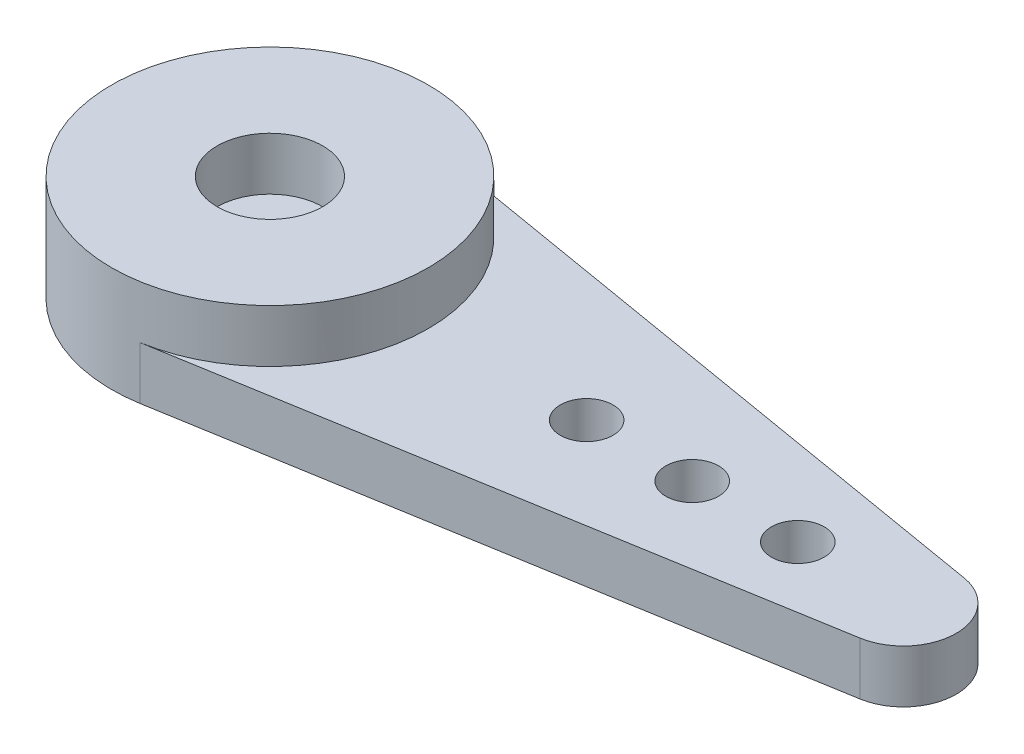
ISO-10303-21;
HEADER;
FILE_DESCRIPTION(('STEP AP214'),'2;1');
FILE_NAME('part.step','',(''),(''),'','','');
FILE_SCHEMA(('AUTOMOTIVE_DESIGN { 1 0 10303 214 1 1 1 1 }'));
ENDSEC;
DATA;
#1=APPLICATION_CONTEXT('core data for automotive mechanical design processes');
#2=APPLICATION_PROTOCOL_DEFINITION('international standard','automotive_design',2000,#1);
#3=PRODUCT_CONTEXT('',#1,'mechanical');
#4=PRODUCT('Part','Part','',(#3));
#5=PRODUCT_RELATED_PRODUCT_CATEGORY('part','',(#4));
#6=PRODUCT_DEFINITION_FORMATION('','',#4);
#7=PRODUCT_DEFINITION_CONTEXT('part definition',#1,'design');
#8=PRODUCT_DEFINITION('design','',#6,#7);
#9=PRODUCT_DEFINITION_SHAPE('','',#8);
#10=(LENGTH_UNIT() NAMED_UNIT(*) SI_UNIT(.MILLI.,.METRE.));
#11=(NAMED_UNIT(*) PLANE_ANGLE_UNIT() SI_UNIT($,.RADIAN.));
#12=(NAMED_UNIT(*) SI_UNIT($,.STERADIAN.) SOLID_ANGLE_UNIT());
#13=UNCERTAINTY_MEASURE_WITH_UNIT(LENGTH_MEASURE(1.E-05),#10,'distance_accuracy_value','');
#14=(GEOMETRIC_REPRESENTATION_CONTEXT(3) GLOBAL_UNCERTAINTY_ASSIGNED_CONTEXT((#13)) GLOBAL_UNIT_ASSIGNED_CONTEXT((#10,
#11,#12)) REPRESENTATION_CONTEXT('',''));
#15=CARTESIAN_POINT('',(0.,0.,0.));
#16=DIRECTION('',(0.,0.,1.));
#17=DIRECTION('',(1.,0.,0.));
#18=AXIS2_PLACEMENT_3D('',#15,#16,#17);
#19=CARTESIAN_POINT('',(0.,5.,0.));
#20=DIRECTION('',(0.,-1.,0.));
#21=DIRECTION('',(0.,0.,-1.));
#22=AXIS2_PLACEMENT_3D('',#19,#20,#21);
#23=CYLINDRICAL_SURFACE('',#22,15.);
#24=CARTESIAN_POINT('',(0.,0.,0.));
#25=DIRECTION('',(0.,1.,0.));
#26=DIRECTION('',(0.,0.,1.));
#27=AXIS2_PLACEMENT_3D('',#24,#25,#26);
#28=CIRCLE('',#27,15.);
#29=CARTESIAN_POINT('',(2.5,0.,-14.790199457749));
#30=VERTEX_POINT('',#29);
#31=CARTESIAN_POINT('',(2.5,0.,14.790199457749));
#32=VERTEX_POINT('',#31);
#33=EDGE_CURVE('E87',#30,#32,#28,.T.);
#34=ORIENTED_EDGE('',*,*,#33,.T.);
#35=DIRECTION('',(0.,-1.,0.));
#36=VECTOR('',#35,1.);
#37=CARTESIAN_POINT('',(2.5,5.,14.790199457749));
#38=LINE('',#37,#36);
#39=CARTESIAN_POINT('',(2.5,5.,14.790199457749));
#40=VERTEX_POINT('',#39);
#41=EDGE_CURVE('E11',#40,#32,#38,.T.);
#42=ORIENTED_EDGE('',*,*,#41,.F.);
#43=CARTESIAN_POINT('',(0.,5.,0.));
#44=DIRECTION('',(0.,1.,0.));
#45=DIRECTION('',(0.,0.,1.));
#46=AXIS2_PLACEMENT_3D('',#43,#44,#45);
#47=CIRCLE('',#46,15.);
#48=CARTESIAN_POINT('',(2.5,5.,-14.790199457749));
#49=VERTEX_POINT('',#48);
#50=EDGE_CURVE('E85',#40,#49,#47,.T.);
#51=ORIENTED_EDGE('',*,*,#50,.T.);
#52=DIRECTION('',(0.,-1.,0.));
#53=VECTOR('',#52,1.);
#54=CARTESIAN_POINT('',(2.5,5.,-14.790199457749));
#55=LINE('',#54,#53);
#56=EDGE_CURVE('E106',#49,#30,#55,.T.);
#57=ORIENTED_EDGE('',*,*,#56,.T.);
#58=EDGE_LOOP('',(#34,#42,#51,#57));
#59=FACE_BOUND('',#58,.T.);
#60=CARTESIAN_POINT('',(0.,10.,0.));
#61=DIRECTION('',(0.,1.,0.));
#62=DIRECTION('',(0.,0.,1.));
#63=AXIS2_PLACEMENT_3D('',#60,#61,#62);
#64=CIRCLE('',#63,15.);
#65=CARTESIAN_POINT('',(0.,10.,15.));
#66=VERTEX_POINT('',#65);
#67=EDGE_CURVE('E94',#66,#66,#64,.T.);
#68=ORIENTED_EDGE('',*,*,#67,.F.);
#69=EDGE_LOOP('',(#68));
#70=FACE_BOUND('',#69,.T.);
#71=ADVANCED_FACE('F34',(#59,#70),#23,.T.);
#72=CARTESIAN_POINT('',(2.5,5.,14.790199457749));
#73=DIRECTION('',(-0.166666666666667,0.,-0.986013297183269));
#74=DIRECTION('',(-0.986013297183269,0.,0.166666666666667));
#75=AXIS2_PLACEMENT_3D('',#72,#73,#74);
#76=PLANE('',#75);
#77=DIRECTION('',(0.986013297183269,0.,-0.166666666666667));
#78=VECTOR('',#77,1.);
#79=CARTESIAN_POINT('',(2.5,0.,14.790199457749));
#80=LINE('',#79,#78);
#81=CARTESIAN_POINT('',(60.8333333333333,0.,4.93006648591634));
#82=VERTEX_POINT('',#81);
#83=EDGE_CURVE('E108',#32,#82,#80,.T.);
#84=ORIENTED_EDGE('',*,*,#83,.T.);
#85=DIRECTION('',(0.,-1.,0.));
#86=VECTOR('',#85,1.);
#87=CARTESIAN_POINT('',(60.8333333333333,5.,4.93006648591634));
#88=LINE('',#87,#86);
#89=CARTESIAN_POINT('',(60.8333333333333,5.,4.93006648591634));
#90=VERTEX_POINT('',#89);
#91=EDGE_CURVE('E42',#90,#82,#88,.T.);
#92=ORIENTED_EDGE('',*,*,#91,.F.);
#93=DIRECTION('',(0.986013297183269,0.,-0.166666666666667));
#94=VECTOR('',#93,1.);
#95=CARTESIAN_POINT('',(2.5,5.,14.790199457749));
#96=LINE('',#95,#94);
#97=EDGE_CURVE('E77',#40,#90,#96,.T.);
#98=ORIENTED_EDGE('',*,*,#97,.F.);
#99=ORIENTED_EDGE('',*,*,#41,.T.);
#100=EDGE_LOOP('',(#84,#92,#98,#99));
#101=FACE_BOUND('',#100,.T.);
#102=ADVANCED_FACE('F89',(#101),#76,.F.);
#103=CARTESIAN_POINT('',(60.,5.,0.));
#104=DIRECTION('',(0.,-1.,0.));
#105=DIRECTION('',(0.,0.,-1.));
#106=AXIS2_PLACEMENT_3D('',#103,#104,#105);
#107=CYLINDRICAL_SURFACE('',#106,5.);
#108=CARTESIAN_POINT('',(60.,0.,0.));
#109=DIRECTION('',(0.,1.,0.));
#110=DIRECTION('',(0.,0.,1.));
#111=AXIS2_PLACEMENT_3D('',#108,#109,#110);
#112=CIRCLE('',#111,5.);
#113=CARTESIAN_POINT('',(60.8333333333333,0.,-4.93006648591634));
#114=VERTEX_POINT('',#113);
#115=EDGE_CURVE('E68',#82,#114,#112,.T.);
#116=ORIENTED_EDGE('',*,*,#115,.T.);
#117=DIRECTION('',(0.,-1.,0.));
#118=VECTOR('',#117,1.);
#119=CARTESIAN_POINT('',(60.8333333333333,5.,-4.93006648591634));
#120=LINE('',#119,#118);
#121=CARTESIAN_POINT('',(60.8333333333333,5.,-4.93006648591634));
#122=VERTEX_POINT('',#121);
#123=EDGE_CURVE('E113',#122,#114,#120,.T.);
#124=ORIENTED_EDGE('',*,*,#123,.F.);
#125=CARTESIAN_POINT('',(60.,5.,0.));
#126=DIRECTION('',(0.,1.,0.));
#127=DIRECTION('',(0.,0.,1.));
#128=AXIS2_PLACEMENT_3D('',#125,#126,#127);
#129=CIRCLE('',#128,5.);
#130=EDGE_CURVE('E91',#90,#122,#129,.T.);
#131=ORIENTED_EDGE('',*,*,#130,.F.);
#132=ORIENTED_EDGE('',*,*,#91,.T.);
#133=EDGE_LOOP('',(#116,#124,#131,#132));
#134=FACE_BOUND('',#133,.T.);
#135=ADVANCED_FACE('F114',(#134),#107,.T.);
#136=CARTESIAN_POINT('',(2.5,5.,-14.790199457749));
#137=DIRECTION('',(-0.166666666666667,0.,0.986013297183269));
#138=DIRECTION('',(0.986013297183269,0.,0.166666666666667));
#139=AXIS2_PLACEMENT_3D('',#136,#137,#138);
#140=PLANE('',#139);
#141=DIRECTION('',(-0.986013297183269,0.,-0.166666666666667));
#142=VECTOR('',#141,1.);
#143=CARTESIAN_POINT('',(2.5,0.,-14.790199457749));
#144=LINE('',#143,#142);
#145=EDGE_CURVE('E73',#114,#30,#144,.T.);
#146=ORIENTED_EDGE('',*,*,#145,.T.);
#147=ORIENTED_EDGE('',*,*,#56,.F.);
#148=DIRECTION('',(-0.986013297183269,0.,-0.166666666666667));
#149=VECTOR('',#148,1.);
#150=CARTESIAN_POINT('',(2.5,5.,-14.790199457749));
#151=LINE('',#150,#149);
#152=EDGE_CURVE('E50',#122,#49,#151,.T.);
#153=ORIENTED_EDGE('',*,*,#152,.F.);
#154=ORIENTED_EDGE('',*,*,#123,.T.);
#155=EDGE_LOOP('',(#146,#147,#153,#154));
#156=FACE_BOUND('',#155,.T.);
#157=ADVANCED_FACE('F128',(#156),#140,.F.);
#158=CARTESIAN_POINT('',(0.,5.,0.));
#159=DIRECTION('',(0.,1.,0.));
#160=DIRECTION('',(0.,0.,1.));
#161=AXIS2_PLACEMENT_3D('',#158,#159,#160);
#162=PLANE('',#161);
#163=CARTESIAN_POINT('',(40.,5.,0.));
#164=DIRECTION('',(0.,1.,0.));
#165=DIRECTION('',(0.,0.,1.));
#166=AXIS2_PLACEMENT_3D('',#163,#164,#165);
#167=CIRCLE('',#166,2.5);
#168=CARTESIAN_POINT('',(40.,5.,2.50000000000007));
#169=VERTEX_POINT('',#168);
#170=EDGE_CURVE('E223',#169,#169,#167,.T.);
#171=ORIENTED_EDGE('',*,*,#170,.F.);
#172=EDGE_LOOP('',(#171));
#173=FACE_BOUND('',#172,.T.);
#174=CARTESIAN_POINT('',(30.,5.,1.39659253553725E-13));
#175=DIRECTION('',(0.,1.,0.));
#176=DIRECTION('',(0.,0.,1.));
#177=AXIS2_PLACEMENT_3D('',#174,#175,#176);
#178=CIRCLE('',#177,2.50000000000001);
#179=CARTESIAN_POINT('',(30.,5.,2.50000000000014));
#180=VERTEX_POINT('',#179);
#181=EDGE_CURVE('E217',#180,#180,#178,.T.);
#182=ORIENTED_EDGE('',*,*,#181,.F.);
#183=EDGE_LOOP('',(#182));
#184=FACE_BOUND('',#183,.T.);
#185=CARTESIAN_POINT('',(50.,5.,0.));
#186=DIRECTION('',(0.,1.,0.));
#187=DIRECTION('',(0.,0.,1.));
#188=AXIS2_PLACEMENT_3D('',#185,#186,#187);
#189=CIRCLE('',#188,2.5);
#190=CARTESIAN_POINT('',(50.,5.,2.5));
#191=VERTEX_POINT('',#190);
#192=EDGE_CURVE('E211',#191,#191,#189,.T.);
#193=ORIENTED_EDGE('',*,*,#192,.F.);
#194=EDGE_LOOP('',(#193));
#195=FACE_BOUND('',#194,.T.);
#196=ORIENTED_EDGE('',*,*,#50,.F.);
#197=ORIENTED_EDGE('',*,*,#97,.T.);
#198=ORIENTED_EDGE('',*,*,#130,.T.);
#199=ORIENTED_EDGE('',*,*,#152,.T.);
#200=EDGE_LOOP('',(#196,#197,#198,#199));
#201=FACE_BOUND('',#200,.T.);
#202=ADVANCED_FACE('F93',(#173,#184,#195,#201),#162,.T.);
#203=CARTESIAN_POINT('',(0.,0.,0.));
#204=DIRECTION('',(0.,1.,0.));
#205=DIRECTION('',(0.,0.,1.));
#206=AXIS2_PLACEMENT_3D('',#203,#204,#205);
#207=PLANE('',#206);
#208=CARTESIAN_POINT('',(40.,0.,0.));
#209=DIRECTION('',(0.,1.,0.));
#210=DIRECTION('',(0.,0.,1.));
#211=AXIS2_PLACEMENT_3D('',#208,#209,#210);
#212=CIRCLE('',#211,2.5);
#213=CARTESIAN_POINT('',(40.,0.,2.50000000000007));
#214=VERTEX_POINT('',#213);
#215=EDGE_CURVE('E215',#214,#214,#212,.T.);
#216=ORIENTED_EDGE('',*,*,#215,.T.);
#217=EDGE_LOOP('',(#216));
#218=FACE_BOUND('',#217,.T.);
#219=CARTESIAN_POINT('',(30.,0.,1.39659253553725E-13));
#220=DIRECTION('',(0.,1.,0.));
#221=DIRECTION('',(0.,0.,1.));
#222=AXIS2_PLACEMENT_3D('',#219,#220,#221);
#223=CIRCLE('',#222,2.50000000000001);
#224=CARTESIAN_POINT('',(30.,0.,2.50000000000014));
#225=VERTEX_POINT('',#224);
#226=EDGE_CURVE('E220',#225,#225,#223,.T.);
#227=ORIENTED_EDGE('',*,*,#226,.T.);
#228=EDGE_LOOP('',(#227));
#229=FACE_BOUND('',#228,.T.);
#230=CARTESIAN_POINT('',(50.,0.,0.));
#231=DIRECTION('',(0.,1.,0.));
#232=DIRECTION('',(0.,0.,1.));
#233=AXIS2_PLACEMENT_3D('',#230,#231,#232);
#234=CIRCLE('',#233,2.5);
#235=CARTESIAN_POINT('',(50.,0.,2.5));
#236=VERTEX_POINT('',#235);
#237=EDGE_CURVE('E209',#236,#236,#234,.T.);
#238=ORIENTED_EDGE('',*,*,#237,.T.);
#239=EDGE_LOOP('',(#238));
#240=FACE_BOUND('',#239,.T.);
#241=ORIENTED_EDGE('',*,*,#33,.F.);
#242=ORIENTED_EDGE('',*,*,#145,.F.);
#243=ORIENTED_EDGE('',*,*,#115,.F.);
#244=ORIENTED_EDGE('',*,*,#83,.F.);
#245=EDGE_LOOP('',(#241,#242,#243,#244));
#246=FACE_BOUND('',#245,.T.);
#247=ADVANCED_FACE('F116',(#218,#229,#240,#246),#207,.F.);
#248=CARTESIAN_POINT('',(0.,10.,0.));
#249=DIRECTION('',(0.,1.,0.));
#250=DIRECTION('',(0.,0.,1.));
#251=AXIS2_PLACEMENT_3D('',#248,#249,#250);
#252=PLANE('',#251);
#253=CARTESIAN_POINT('',(0.,10.,0.));
#254=DIRECTION('',(0.,1.,0.));
#255=DIRECTION('',(0.,0.,1.));
#256=AXIS2_PLACEMENT_3D('',#253,#254,#255);
#257=CIRCLE('',#256,5.);
#258=CARTESIAN_POINT('',(0.,10.,5.));
#259=VERTEX_POINT('',#258);
#260=EDGE_CURVE('E100',#259,#259,#257,.T.);
#261=ORIENTED_EDGE('',*,*,#260,.F.);
#262=EDGE_LOOP('',(#261));
#263=FACE_BOUND('',#262,.T.);
#264=ORIENTED_EDGE('',*,*,#67,.T.);
#265=EDGE_LOOP('',(#264));
#266=FACE_BOUND('',#265,.T.);
#267=ADVANCED_FACE('F118',(#263,#266),#252,.T.);
#268=CARTESIAN_POINT('',(0.,5.,0.));
#269=DIRECTION('',(0.,1.,0.));
#270=DIRECTION('',(0.,0.,1.));
#271=AXIS2_PLACEMENT_3D('',#268,#269,#270);
#272=CYLINDRICAL_SURFACE('',#271,5.);
#273=CARTESIAN_POINT('',(0.,5.,0.));
#274=DIRECTION('',(0.,1.,0.));
#275=DIRECTION('',(0.,0.,1.));
#276=AXIS2_PLACEMENT_3D('',#273,#274,#275);
#277=CIRCLE('',#276,5.);
#278=CARTESIAN_POINT('',(0.,5.,5.));
#279=VERTEX_POINT('',#278);
#280=EDGE_CURVE('E95',#279,#279,#277,.T.);
#281=ORIENTED_EDGE('',*,*,#280,.F.);
#282=EDGE_LOOP('',(#281));
#283=FACE_BOUND('',#282,.T.);
#284=ORIENTED_EDGE('',*,*,#260,.T.);
#285=EDGE_LOOP('',(#284));
#286=FACE_BOUND('',#285,.T.);
#287=ADVANCED_FACE('F125',(#283,#286),#272,.F.);
#288=CARTESIAN_POINT('',(0.,5.,0.));
#289=DIRECTION('',(0.,1.,0.));
#290=DIRECTION('',(0.,0.,1.));
#291=AXIS2_PLACEMENT_3D('',#288,#289,#290);
#292=PLANE('',#291);
#293=ORIENTED_EDGE('',*,*,#280,.T.);
#294=EDGE_LOOP('',(#293));
#295=FACE_BOUND('',#294,.T.);
#296=ADVANCED_FACE('F158',(#295),#292,.T.);
#297=CARTESIAN_POINT('',(50.,0.,0.));
#298=DIRECTION('',(0.,1.,0.));
#299=DIRECTION('',(0.,0.,1.));
#300=AXIS2_PLACEMENT_3D('',#297,#298,#299);
#301=CYLINDRICAL_SURFACE('',#300,2.5);
#302=ORIENTED_EDGE('',*,*,#237,.F.);
#303=EDGE_LOOP('',(#302));
#304=FACE_BOUND('',#303,.T.);
#305=ORIENTED_EDGE('',*,*,#192,.T.);
#306=EDGE_LOOP('',(#305));
#307=FACE_BOUND('',#306,.T.);
#308=ADVANCED_FACE('F168',(#304,#307),#301,.F.);
#309=CARTESIAN_POINT('',(30.,0.,1.39659253553725E-13));
#310=DIRECTION('',(0.,1.,0.));
#311=DIRECTION('',(0.,0.,1.));
#312=AXIS2_PLACEMENT_3D('',#309,#310,#311);
#313=CYLINDRICAL_SURFACE('',#312,2.50000000000001);
#314=ORIENTED_EDGE('',*,*,#226,.F.);
#315=EDGE_LOOP('',(#314));
#316=FACE_BOUND('',#315,.T.);
#317=ORIENTED_EDGE('',*,*,#181,.T.);
#318=EDGE_LOOP('',(#317));
#319=FACE_BOUND('',#318,.T.);
#320=ADVANCED_FACE('F173',(#316,#319),#313,.F.);
#321=CARTESIAN_POINT('',(40.,0.,0.));
#322=DIRECTION('',(0.,1.,0.));
#323=DIRECTION('',(0.,0.,1.));
#324=AXIS2_PLACEMENT_3D('',#321,#322,#323);
#325=CYLINDRICAL_SURFACE('',#324,2.5);
#326=ORIENTED_EDGE('',*,*,#215,.F.);
#327=EDGE_LOOP('',(#326));
#328=FACE_BOUND('',#327,.T.);
#329=ORIENTED_EDGE('',*,*,#170,.T.);
#330=EDGE_LOOP('',(#329));
#331=FACE_BOUND('',#330,.T.);
#332=ADVANCED_FACE('F183',(#328,#331),#325,.F.);
#333=CLOSED_SHELL('',(#71,#102,#135,#157,#202,#247,#267,#287,#296,#308,#320,#332));
#334=MANIFOLD_SOLID_BREP('B2',#333);
#335=ADVANCED_BREP_SHAPE_REPRESENTATION('',(#18,#334),#14);
#336=SHAPE_DEFINITION_REPRESENTATION(#9,#335);
ENDSEC;
END-ISO-10303-21;
